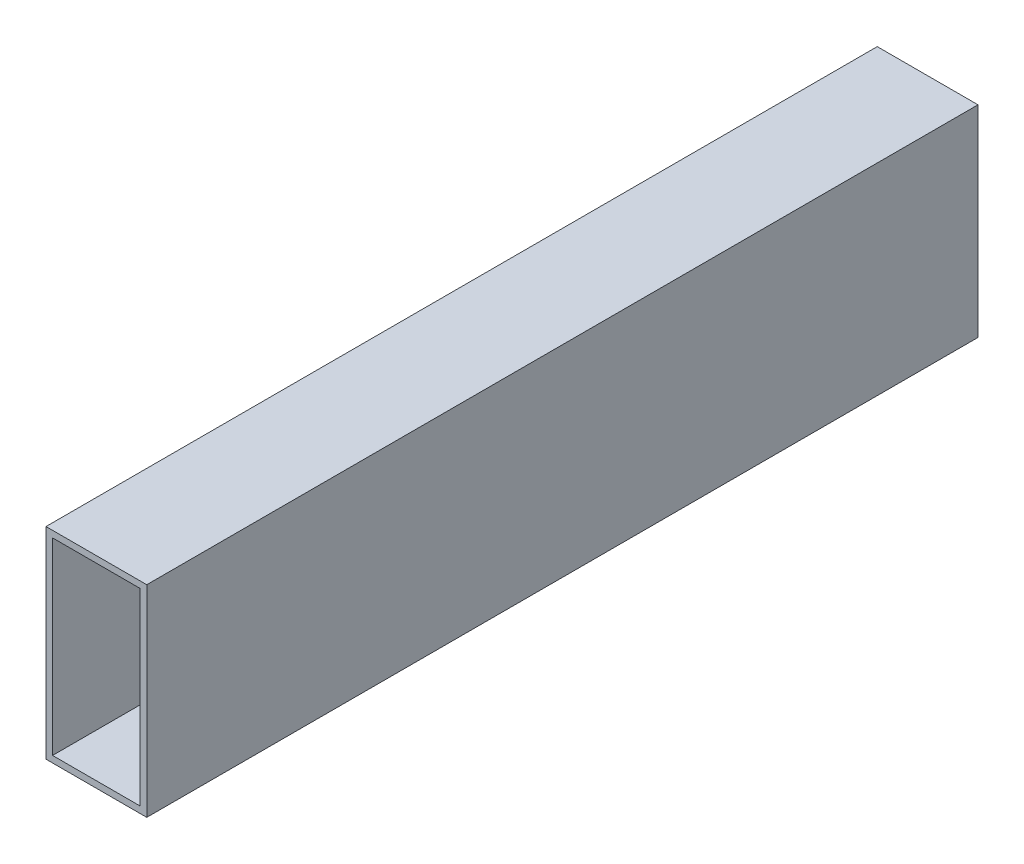
ISO-10303-21;
HEADER;
FILE_DESCRIPTION(('STEP AP214'),'2;1');
FILE_NAME('part.step','',(''),(''),'','','');
FILE_SCHEMA(('AUTOMOTIVE_DESIGN { 1 0 10303 214 1 1 1 1 }'));
ENDSEC;
DATA;
#1=APPLICATION_CONTEXT('core data for automotive mechanical design processes');
#2=APPLICATION_PROTOCOL_DEFINITION('international standard','automotive_design',2000,#1);
#3=PRODUCT_CONTEXT('',#1,'mechanical');
#4=PRODUCT('Part','Part','',(#3));
#5=PRODUCT_RELATED_PRODUCT_CATEGORY('part','',(#4));
#6=PRODUCT_DEFINITION_FORMATION('','',#4);
#7=PRODUCT_DEFINITION_CONTEXT('part definition',#1,'design');
#8=PRODUCT_DEFINITION('design','',#6,#7);
#9=PRODUCT_DEFINITION_SHAPE('','',#8);
#10=(LENGTH_UNIT() NAMED_UNIT(*) SI_UNIT(.MILLI.,.METRE.));
#11=(NAMED_UNIT(*) PLANE_ANGLE_UNIT() SI_UNIT($,.RADIAN.));
#12=(NAMED_UNIT(*) SI_UNIT($,.STERADIAN.) SOLID_ANGLE_UNIT());
#13=UNCERTAINTY_MEASURE_WITH_UNIT(LENGTH_MEASURE(1.E-05),#10,'distance_accuracy_value','');
#14=(GEOMETRIC_REPRESENTATION_CONTEXT(3) GLOBAL_UNCERTAINTY_ASSIGNED_CONTEXT((#13)) GLOBAL_UNIT_ASSIGNED_CONTEXT((#10,
#11,#12)) REPRESENTATION_CONTEXT('',''));
#15=CARTESIAN_POINT('',(0.,0.,0.));
#16=DIRECTION('',(0.,0.,1.));
#17=DIRECTION('',(1.,0.,0.));
#18=AXIS2_PLACEMENT_3D('',#15,#16,#17);
#19=CARTESIAN_POINT('',(0.,0.,209.55));
#20=DIRECTION('',(0.,0.,-1.));
#21=DIRECTION('',(-1.,0.,0.));
#22=AXIS2_PLACEMENT_3D('',#19,#20,#21);
#23=PLANE('',#22);
#24=DIRECTION('',(0.,-1.,0.));
#25=VECTOR('',#24,1.);
#26=CARTESIAN_POINT('',(-50.4994082840236,-42.8661992210938,209.55));
#27=LINE('',#26,#25);
#28=CARTESIAN_POINT('',(-50.4994082840236,7.93380077890623,209.55));
#29=VERTEX_POINT('',#28);
#30=CARTESIAN_POINT('',(-50.4994082840236,-42.8661992210938,209.55));
#31=VERTEX_POINT('',#30);
#32=EDGE_CURVE('E134',#29,#31,#27,.T.);
#33=ORIENTED_EDGE('',*,*,#32,.T.);
#34=DIRECTION('',(1.,0.,0.));
#35=VECTOR('',#34,1.);
#36=CARTESIAN_POINT('',(-50.4994082840236,-42.8661992210938,209.55));
#37=LINE('',#36,#35);
#38=CARTESIAN_POINT('',(-25.0994082840236,-42.8661992210938,209.55));
#39=VERTEX_POINT('',#38);
#40=EDGE_CURVE('E137',#31,#39,#37,.T.);
#41=ORIENTED_EDGE('',*,*,#40,.T.);
#42=DIRECTION('',(0.,1.,0.));
#43=VECTOR('',#42,1.);
#44=CARTESIAN_POINT('',(-25.0994082840236,-42.8661992210938,209.55));
#45=LINE('',#44,#43);
#46=CARTESIAN_POINT('',(-25.0994082840236,7.93380077890623,209.55));
#47=VERTEX_POINT('',#46);
#48=EDGE_CURVE('E140',#39,#47,#45,.T.);
#49=ORIENTED_EDGE('',*,*,#48,.T.);
#50=DIRECTION('',(-1.,0.,0.));
#51=VECTOR('',#50,1.);
#52=CARTESIAN_POINT('',(-50.4994082840236,7.93380077890623,209.55));
#53=LINE('',#52,#51);
#54=EDGE_CURVE('E142',#47,#29,#53,.T.);
#55=ORIENTED_EDGE('',*,*,#54,.T.);
#56=EDGE_LOOP('',(#33,#41,#49,#55));
#57=FACE_BOUND('',#56,.T.);
#58=DIRECTION('',(0.,1.,0.));
#59=VECTOR('',#58,1.);
#60=CARTESIAN_POINT('',(-26.7504082840236,6.28280077890622,209.55));
#61=LINE('',#60,#59);
#62=CARTESIAN_POINT('',(-26.7504082840236,-41.2151992210938,209.55));
#63=VERTEX_POINT('',#62);
#64=CARTESIAN_POINT('',(-26.7504082840236,6.28280077890622,209.55));
#65=VERTEX_POINT('',#64);
#66=EDGE_CURVE('E98',#63,#65,#61,.T.);
#67=ORIENTED_EDGE('',*,*,#66,.F.);
#68=DIRECTION('',(1.,0.,0.));
#69=VECTOR('',#68,1.);
#70=CARTESIAN_POINT('',(-48.8484082840236,-41.2151992210938,209.55));
#71=LINE('',#70,#69);
#72=CARTESIAN_POINT('',(-48.8484082840236,-41.2151992210938,209.55));
#73=VERTEX_POINT('',#72);
#74=EDGE_CURVE('E120',#73,#63,#71,.T.);
#75=ORIENTED_EDGE('',*,*,#74,.F.);
#76=DIRECTION('',(0.,-1.,0.));
#77=VECTOR('',#76,1.);
#78=CARTESIAN_POINT('',(-48.8484082840236,6.28280077890622,209.55));
#79=LINE('',#78,#77);
#80=CARTESIAN_POINT('',(-48.8484082840236,6.28280077890622,209.55));
#81=VERTEX_POINT('',#80);
#82=EDGE_CURVE('E118',#81,#73,#79,.T.);
#83=ORIENTED_EDGE('',*,*,#82,.F.);
#84=DIRECTION('',(-1.,0.,0.));
#85=VECTOR('',#84,1.);
#86=CARTESIAN_POINT('',(-48.8484082840236,6.28280077890622,209.55));
#87=LINE('',#86,#85);
#88=EDGE_CURVE('E106',#65,#81,#87,.T.);
#89=ORIENTED_EDGE('',*,*,#88,.F.);
#90=EDGE_LOOP('',(#67,#75,#83,#89));
#91=FACE_BOUND('',#90,.T.);
#92=ADVANCED_FACE('F33',(#57,#91),#23,.F.);
#93=CARTESIAN_POINT('',(0.,0.,0.));
#94=DIRECTION('',(0.,0.,-1.));
#95=DIRECTION('',(-1.,0.,0.));
#96=AXIS2_PLACEMENT_3D('',#93,#94,#95);
#97=PLANE('',#96);
#98=DIRECTION('',(0.,-1.,0.));
#99=VECTOR('',#98,1.);
#100=CARTESIAN_POINT('',(-50.4994082840236,-42.8661992210938,0.));
#101=LINE('',#100,#99);
#102=CARTESIAN_POINT('',(-50.4994082840236,7.93380077890623,0.));
#103=VERTEX_POINT('',#102);
#104=CARTESIAN_POINT('',(-50.4994082840236,-42.8661992210938,0.));
#105=VERTEX_POINT('',#104);
#106=EDGE_CURVE('E114',#103,#105,#101,.T.);
#107=ORIENTED_EDGE('',*,*,#106,.F.);
#108=DIRECTION('',(-1.,0.,0.));
#109=VECTOR('',#108,1.);
#110=CARTESIAN_POINT('',(-50.4994082840236,7.93380077890623,0.));
#111=LINE('',#110,#109);
#112=CARTESIAN_POINT('',(-25.0994082840236,7.93380077890623,0.));
#113=VERTEX_POINT('',#112);
#114=EDGE_CURVE('E138',#113,#103,#111,.T.);
#115=ORIENTED_EDGE('',*,*,#114,.F.);
#116=DIRECTION('',(0.,1.,0.));
#117=VECTOR('',#116,1.);
#118=CARTESIAN_POINT('',(-25.0994082840236,-42.8661992210938,0.));
#119=LINE('',#118,#117);
#120=CARTESIAN_POINT('',(-25.0994082840236,-42.8661992210938,0.));
#121=VERTEX_POINT('',#120);
#122=EDGE_CURVE('E149',#121,#113,#119,.T.);
#123=ORIENTED_EDGE('',*,*,#122,.F.);
#124=DIRECTION('',(1.,0.,0.));
#125=VECTOR('',#124,1.);
#126=CARTESIAN_POINT('',(-50.4994082840236,-42.8661992210938,0.));
#127=LINE('',#126,#125);
#128=EDGE_CURVE('E147',#105,#121,#127,.T.);
#129=ORIENTED_EDGE('',*,*,#128,.F.);
#130=EDGE_LOOP('',(#107,#115,#123,#129));
#131=FACE_BOUND('',#130,.T.);
#132=DIRECTION('',(1.,0.,0.));
#133=VECTOR('',#132,1.);
#134=CARTESIAN_POINT('',(-48.8484082840236,-41.2151992210938,0.));
#135=LINE('',#134,#133);
#136=CARTESIAN_POINT('',(-48.8484082840236,-41.2151992210938,0.));
#137=VERTEX_POINT('',#136);
#138=CARTESIAN_POINT('',(-26.7504082840236,-41.2151992210938,0.));
#139=VERTEX_POINT('',#138);
#140=EDGE_CURVE('E107',#137,#139,#135,.T.);
#141=ORIENTED_EDGE('',*,*,#140,.T.);
#142=DIRECTION('',(0.,1.,0.));
#143=VECTOR('',#142,1.);
#144=CARTESIAN_POINT('',(-26.7504082840236,6.28280077890622,0.));
#145=LINE('',#144,#143);
#146=CARTESIAN_POINT('',(-26.7504082840236,6.28280077890622,0.));
#147=VERTEX_POINT('',#146);
#148=EDGE_CURVE('E56',#139,#147,#145,.T.);
#149=ORIENTED_EDGE('',*,*,#148,.T.);
#150=DIRECTION('',(-1.,0.,0.));
#151=VECTOR('',#150,1.);
#152=CARTESIAN_POINT('',(-48.8484082840236,6.28280077890622,0.));
#153=LINE('',#152,#151);
#154=CARTESIAN_POINT('',(-48.8484082840236,6.28280077890622,0.));
#155=VERTEX_POINT('',#154);
#156=EDGE_CURVE('E113',#147,#155,#153,.T.);
#157=ORIENTED_EDGE('',*,*,#156,.T.);
#158=DIRECTION('',(0.,-1.,0.));
#159=VECTOR('',#158,1.);
#160=CARTESIAN_POINT('',(-48.8484082840236,6.28280077890622,0.));
#161=LINE('',#160,#159);
#162=EDGE_CURVE('E126',#155,#137,#161,.T.);
#163=ORIENTED_EDGE('',*,*,#162,.T.);
#164=EDGE_LOOP('',(#141,#149,#157,#163));
#165=FACE_BOUND('',#164,.T.);
#166=ADVANCED_FACE('F167',(#131,#165),#97,.T.);
#167=CARTESIAN_POINT('',(-50.4994082840236,-42.8661992210938,209.55));
#168=DIRECTION('',(1.,0.,0.));
#169=DIRECTION('',(0.,0.,-1.));
#170=AXIS2_PLACEMENT_3D('',#167,#168,#169);
#171=PLANE('',#170);
#172=ORIENTED_EDGE('',*,*,#106,.T.);
#173=DIRECTION('',(0.,0.,-1.));
#174=VECTOR('',#173,1.);
#175=CARTESIAN_POINT('',(-50.4994082840236,-42.8661992210938,209.55));
#176=LINE('',#175,#174);
#177=EDGE_CURVE('E11',#31,#105,#176,.T.);
#178=ORIENTED_EDGE('',*,*,#177,.F.);
#179=ORIENTED_EDGE('',*,*,#32,.F.);
#180=DIRECTION('',(0.,0.,-1.));
#181=VECTOR('',#180,1.);
#182=CARTESIAN_POINT('',(-50.4994082840236,7.93380077890623,209.55));
#183=LINE('',#182,#181);
#184=EDGE_CURVE('E144',#29,#103,#183,.T.);
#185=ORIENTED_EDGE('',*,*,#184,.T.);
#186=EDGE_LOOP('',(#172,#178,#179,#185));
#187=FACE_BOUND('',#186,.T.);
#188=ADVANCED_FACE('F35',(#187),#171,.F.);
#189=CARTESIAN_POINT('',(-50.4994082840236,-42.8661992210938,209.55));
#190=DIRECTION('',(0.,1.,0.));
#191=DIRECTION('',(0.,0.,1.));
#192=AXIS2_PLACEMENT_3D('',#189,#190,#191);
#193=PLANE('',#192);
#194=ORIENTED_EDGE('',*,*,#128,.T.);
#195=DIRECTION('',(0.,0.,-1.));
#196=VECTOR('',#195,1.);
#197=CARTESIAN_POINT('',(-25.0994082840236,-42.8661992210938,209.55));
#198=LINE('',#197,#196);
#199=EDGE_CURVE('E41',#39,#121,#198,.T.);
#200=ORIENTED_EDGE('',*,*,#199,.F.);
#201=ORIENTED_EDGE('',*,*,#40,.F.);
#202=ORIENTED_EDGE('',*,*,#177,.T.);
#203=EDGE_LOOP('',(#194,#200,#201,#202));
#204=FACE_BOUND('',#203,.T.);
#205=ADVANCED_FACE('F177',(#204),#193,.F.);
#206=CARTESIAN_POINT('',(-25.0994082840236,-42.8661992210938,209.55));
#207=DIRECTION('',(-1.,0.,0.));
#208=DIRECTION('',(0.,0.,1.));
#209=AXIS2_PLACEMENT_3D('',#206,#207,#208);
#210=PLANE('',#209);
#211=ORIENTED_EDGE('',*,*,#122,.T.);
#212=DIRECTION('',(0.,0.,-1.));
#213=VECTOR('',#212,1.);
#214=CARTESIAN_POINT('',(-25.0994082840236,7.93380077890623,209.55));
#215=LINE('',#214,#213);
#216=EDGE_CURVE('E154',#47,#113,#215,.T.);
#217=ORIENTED_EDGE('',*,*,#216,.F.);
#218=ORIENTED_EDGE('',*,*,#48,.F.);
#219=ORIENTED_EDGE('',*,*,#199,.T.);
#220=EDGE_LOOP('',(#211,#217,#218,#219));
#221=FACE_BOUND('',#220,.T.);
#222=ADVANCED_FACE('F161',(#221),#210,.F.);
#223=CARTESIAN_POINT('',(-50.4994082840236,7.93380077890623,209.55));
#224=DIRECTION('',(0.,-1.,0.));
#225=DIRECTION('',(1.,0.,0.));
#226=AXIS2_PLACEMENT_3D('',#223,#224,#225);
#227=PLANE('',#226);
#228=ORIENTED_EDGE('',*,*,#114,.T.);
#229=ORIENTED_EDGE('',*,*,#184,.F.);
#230=ORIENTED_EDGE('',*,*,#54,.F.);
#231=ORIENTED_EDGE('',*,*,#216,.T.);
#232=EDGE_LOOP('',(#228,#229,#230,#231));
#233=FACE_BOUND('',#232,.T.);
#234=ADVANCED_FACE('F171',(#233),#227,.F.);
#235=CARTESIAN_POINT('',(-26.7504082840236,6.28280077890622,209.55));
#236=DIRECTION('',(-1.,0.,0.));
#237=DIRECTION('',(0.,-1.,0.));
#238=AXIS2_PLACEMENT_3D('',#235,#236,#237);
#239=PLANE('',#238);
#240=ORIENTED_EDGE('',*,*,#148,.F.);
#241=DIRECTION('',(0.,0.,-1.));
#242=VECTOR('',#241,1.);
#243=CARTESIAN_POINT('',(-26.7504082840236,-41.2151992210938,209.55));
#244=LINE('',#243,#242);
#245=EDGE_CURVE('E102',#63,#139,#244,.T.);
#246=ORIENTED_EDGE('',*,*,#245,.F.);
#247=ORIENTED_EDGE('',*,*,#66,.T.);
#248=DIRECTION('',(0.,0.,-1.));
#249=VECTOR('',#248,1.);
#250=CARTESIAN_POINT('',(-26.7504082840236,6.28280077890622,209.55));
#251=LINE('',#250,#249);
#252=EDGE_CURVE('E101',#65,#147,#251,.T.);
#253=ORIENTED_EDGE('',*,*,#252,.T.);
#254=EDGE_LOOP('',(#240,#246,#247,#253));
#255=FACE_BOUND('',#254,.T.);
#256=ADVANCED_FACE('F100',(#255),#239,.T.);
#257=CARTESIAN_POINT('',(-48.8484082840236,6.28280077890622,209.55));
#258=DIRECTION('',(0.,-1.,0.));
#259=DIRECTION('',(0.,0.,-1.));
#260=AXIS2_PLACEMENT_3D('',#257,#258,#259);
#261=PLANE('',#260);
#262=ORIENTED_EDGE('',*,*,#156,.F.);
#263=ORIENTED_EDGE('',*,*,#252,.F.);
#264=ORIENTED_EDGE('',*,*,#88,.T.);
#265=DIRECTION('',(0.,0.,-1.));
#266=VECTOR('',#265,1.);
#267=CARTESIAN_POINT('',(-48.8484082840236,6.28280077890622,209.55));
#268=LINE('',#267,#266);
#269=EDGE_CURVE('E115',#81,#155,#268,.T.);
#270=ORIENTED_EDGE('',*,*,#269,.T.);
#271=EDGE_LOOP('',(#262,#263,#264,#270));
#272=FACE_BOUND('',#271,.T.);
#273=ADVANCED_FACE('F110',(#272),#261,.T.);
#274=CARTESIAN_POINT('',(-48.8484082840236,6.28280077890622,209.55));
#275=DIRECTION('',(1.,0.,0.));
#276=DIRECTION('',(0.,1.,0.));
#277=AXIS2_PLACEMENT_3D('',#274,#275,#276);
#278=PLANE('',#277);
#279=ORIENTED_EDGE('',*,*,#162,.F.);
#280=ORIENTED_EDGE('',*,*,#269,.F.);
#281=ORIENTED_EDGE('',*,*,#82,.T.);
#282=DIRECTION('',(0.,0.,-1.));
#283=VECTOR('',#282,1.);
#284=CARTESIAN_POINT('',(-48.8484082840236,-41.2151992210938,209.55));
#285=LINE('',#284,#283);
#286=EDGE_CURVE('E48',#73,#137,#285,.T.);
#287=ORIENTED_EDGE('',*,*,#286,.T.);
#288=EDGE_LOOP('',(#279,#280,#281,#287));
#289=FACE_BOUND('',#288,.T.);
#290=ADVANCED_FACE('F200',(#289),#278,.T.);
#291=CARTESIAN_POINT('',(-48.8484082840236,-41.2151992210938,209.55));
#292=DIRECTION('',(0.,1.,0.));
#293=DIRECTION('',(0.,0.,1.));
#294=AXIS2_PLACEMENT_3D('',#291,#292,#293);
#295=PLANE('',#294);
#296=ORIENTED_EDGE('',*,*,#140,.F.);
#297=ORIENTED_EDGE('',*,*,#286,.F.);
#298=ORIENTED_EDGE('',*,*,#74,.T.);
#299=ORIENTED_EDGE('',*,*,#245,.T.);
#300=EDGE_LOOP('',(#296,#297,#298,#299));
#301=FACE_BOUND('',#300,.T.);
#302=ADVANCED_FACE('F204',(#301),#295,.T.);
#303=CLOSED_SHELL('',(#92,#166,#188,#205,#222,#234,#256,#273,#290,#302));
#304=MANIFOLD_SOLID_BREP('B2',#303);
#305=ADVANCED_BREP_SHAPE_REPRESENTATION('',(#18,#304),#14);
#306=SHAPE_DEFINITION_REPRESENTATION(#9,#305);
ENDSEC;
END-ISO-10303-21;
